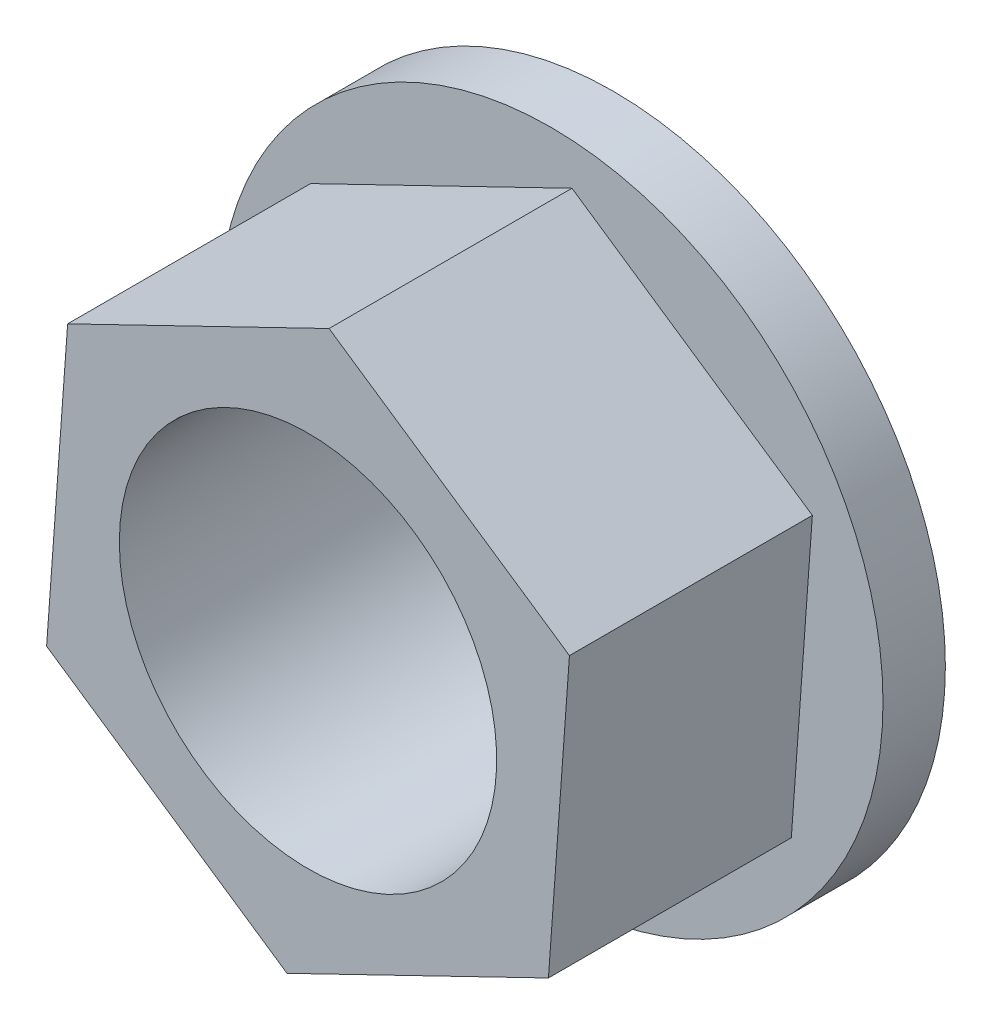
ISO-10303-21;
HEADER;
FILE_DESCRIPTION(('STEP AP214'),'2;1');
FILE_NAME('part.step','',(''),(''),'','','');
FILE_SCHEMA(('AUTOMOTIVE_DESIGN { 1 0 10303 214 1 1 1 1 }'));
ENDSEC;
DATA;
#1=APPLICATION_CONTEXT('core data for automotive mechanical design processes');
#2=APPLICATION_PROTOCOL_DEFINITION('international standard','automotive_design',2000,#1);
#3=PRODUCT_CONTEXT('',#1,'mechanical');
#4=PRODUCT('Part','Part','',(#3));
#5=PRODUCT_RELATED_PRODUCT_CATEGORY('part','',(#4));
#6=PRODUCT_DEFINITION_FORMATION('','',#4);
#7=PRODUCT_DEFINITION_CONTEXT('part definition',#1,'design');
#8=PRODUCT_DEFINITION('design','',#6,#7);
#9=PRODUCT_DEFINITION_SHAPE('','',#8);
#10=(LENGTH_UNIT() NAMED_UNIT(*) SI_UNIT(.MILLI.,.METRE.));
#11=(NAMED_UNIT(*) PLANE_ANGLE_UNIT() SI_UNIT($,.RADIAN.));
#12=(NAMED_UNIT(*) SI_UNIT($,.STERADIAN.) SOLID_ANGLE_UNIT());
#13=UNCERTAINTY_MEASURE_WITH_UNIT(LENGTH_MEASURE(1.E-05),#10,'distance_accuracy_value','');
#14=(GEOMETRIC_REPRESENTATION_CONTEXT(3) GLOBAL_UNCERTAINTY_ASSIGNED_CONTEXT((#13)) GLOBAL_UNIT_ASSIGNED_CONTEXT((#10,
#11,#12)) REPRESENTATION_CONTEXT('',''));
#15=CARTESIAN_POINT('',(0.,0.,0.));
#16=DIRECTION('',(0.,0.,1.));
#17=DIRECTION('',(1.,0.,0.));
#18=AXIS2_PLACEMENT_3D('',#15,#16,#17);
#19=CARTESIAN_POINT('',(0.,0.,0.7874));
#20=DIRECTION('',(0.,0.,1.));
#21=DIRECTION('',(1.,0.,0.));
#22=AXIS2_PLACEMENT_3D('',#19,#20,#21);
#23=PLANE('',#22);
#24=CARTESIAN_POINT('',(0.,0.,0.7874));
#25=DIRECTION('',(0.,0.,1.));
#26=DIRECTION('',(1.,0.,0.));
#27=AXIS2_PLACEMENT_3D('',#24,#25,#26);
#28=CIRCLE('',#27,4.191);
#29=CARTESIAN_POINT('',(4.191,0.,0.7874));
#30=VERTEX_POINT('',#29);
#31=EDGE_CURVE('E12',#30,#30,#28,.T.);
#32=ORIENTED_EDGE('',*,*,#31,.T.);
#33=EDGE_LOOP('',(#32));
#34=FACE_BOUND('',#33,.T.);
#35=DIRECTION('',(-0.899936060407233,-0.436021888416979,0.));
#36=VECTOR('',#35,1.);
#37=CARTESIAN_POINT('',(1.38436949572391,-2.85729699179297,0.7874));
#38=LINE('',#37,#36);
#39=CARTESIAN_POINT('',(3.03403068309029,-2.05803089077886,0.7874));
#40=VERTEX_POINT('',#39);
#41=CARTESIAN_POINT('',(-0.265291691642468,-3.65656309280707,0.7874));
#42=VERTEX_POINT('',#41);
#43=EDGE_CURVE('E132',#40,#42,#38,.T.);
#44=ORIENTED_EDGE('',*,*,#43,.T.);
#45=DIRECTION('',(-0.827574062178784,0.561356545885862,0.));
#46=VECTOR('',#45,1.);
#47=CARTESIAN_POINT('',(-1.78230703318761,-2.62754764741764,0.7874));
#48=LINE('',#47,#46);
#49=CARTESIAN_POINT('',(-3.29932237473275,-1.59853220202821,0.7874));
#50=VERTEX_POINT('',#49);
#51=EDGE_CURVE('E64',#42,#50,#48,.T.);
#52=ORIENTED_EDGE('',*,*,#51,.T.);
#53=DIRECTION('',(0.072361998228448,0.997378434302841,0.));
#54=VECTOR('',#53,1.);
#55=CARTESIAN_POINT('',(-3.16667652891152,0.229749344375323,0.7874));
#56=LINE('',#55,#54);
#57=CARTESIAN_POINT('',(-3.03403068309029,2.05803089077886,0.7874));
#58=VERTEX_POINT('',#57);
#59=EDGE_CURVE('E115',#50,#58,#56,.T.);
#60=ORIENTED_EDGE('',*,*,#59,.T.);
#61=DIRECTION('',(0.899936060407233,0.436021888416979,0.));
#62=VECTOR('',#61,1.);
#63=CARTESIAN_POINT('',(-1.38436949572391,2.85729699179297,0.7874));
#64=LINE('',#63,#62);
#65=CARTESIAN_POINT('',(0.265291691642464,3.65656309280707,0.7874));
#66=VERTEX_POINT('',#65);
#67=EDGE_CURVE('E118',#58,#66,#64,.T.);
#68=ORIENTED_EDGE('',*,*,#67,.T.);
#69=DIRECTION('',(0.827574062178785,-0.561356545885861,0.));
#70=VECTOR('',#69,1.);
#71=CARTESIAN_POINT('',(1.78230703318761,2.62754764741764,0.7874));
#72=LINE('',#71,#70);
#73=CARTESIAN_POINT('',(3.29932237473275,1.59853220202821,0.7874));
#74=VERTEX_POINT('',#73);
#75=EDGE_CURVE('E126',#66,#74,#72,.T.);
#76=ORIENTED_EDGE('',*,*,#75,.T.);
#77=DIRECTION('',(-0.0723619982284483,-0.997378434302841,0.));
#78=VECTOR('',#77,1.);
#79=CARTESIAN_POINT('',(3.16667652891152,-0.229749344375323,0.7874));
#80=LINE('',#79,#78);
#81=EDGE_CURVE('E129',#74,#40,#80,.T.);
#82=ORIENTED_EDGE('',*,*,#81,.T.);
#83=EDGE_LOOP('',(#44,#52,#60,#68,#76,#82));
#84=FACE_BOUND('',#83,.T.);
#85=ADVANCED_FACE('F41',(#34,#84),#23,.T.);
#86=CARTESIAN_POINT('',(0.,0.,0.7874));
#87=DIRECTION('',(0.,0.,-1.));
#88=DIRECTION('',(-1.,0.,0.));
#89=AXIS2_PLACEMENT_3D('',#86,#87,#88);
#90=CYLINDRICAL_SURFACE('',#89,4.191);
#91=ORIENTED_EDGE('',*,*,#31,.F.);
#92=EDGE_LOOP('',(#91));
#93=FACE_BOUND('',#92,.T.);
#94=CARTESIAN_POINT('',(0.,0.,0.));
#95=DIRECTION('',(0.,0.,1.));
#96=DIRECTION('',(1.,0.,0.));
#97=AXIS2_PLACEMENT_3D('',#94,#95,#96);
#98=CIRCLE('',#97,4.191);
#99=CARTESIAN_POINT('',(4.191,0.,0.));
#100=VERTEX_POINT('',#99);
#101=EDGE_CURVE('E45',#100,#100,#98,.T.);
#102=ORIENTED_EDGE('',*,*,#101,.T.);
#103=EDGE_LOOP('',(#102));
#104=FACE_BOUND('',#103,.T.);
#105=ADVANCED_FACE('F43',(#93,#104),#90,.T.);
#106=CARTESIAN_POINT('',(0.,0.,0.));
#107=DIRECTION('',(0.,0.,1.));
#108=DIRECTION('',(1.,0.,0.));
#109=AXIS2_PLACEMENT_3D('',#106,#107,#108);
#110=PLANE('',#109);
#111=CARTESIAN_POINT('',(0.,0.,0.));
#112=DIRECTION('',(0.,0.,-1.));
#113=DIRECTION('',(-1.,0.,0.));
#114=AXIS2_PLACEMENT_3D('',#111,#112,#113);
#115=CIRCLE('',#114,2.38125);
#116=CARTESIAN_POINT('',(-2.38125,0.,0.));
#117=VERTEX_POINT('',#116);
#118=EDGE_CURVE('E184',#117,#117,#115,.T.);
#119=ORIENTED_EDGE('',*,*,#118,.F.);
#120=EDGE_LOOP('',(#119));
#121=FACE_BOUND('',#120,.T.);
#122=ORIENTED_EDGE('',*,*,#101,.F.);
#123=EDGE_LOOP('',(#122));
#124=FACE_BOUND('',#123,.T.);
#125=ADVANCED_FACE('F139',(#121,#124),#110,.F.);
#126=CARTESIAN_POINT('',(-3.29932237473275,-1.59853220202821,3.85318));
#127=DIRECTION('',(0.561356545885862,0.827574062178784,0.));
#128=DIRECTION('',(-0.827574062178784,0.561356545885862,0.));
#129=AXIS2_PLACEMENT_3D('',#126,#127,#128);
#130=PLANE('',#129);
#131=ORIENTED_EDGE('',*,*,#51,.F.);
#132=DIRECTION('',(0.,0.,-1.));
#133=VECTOR('',#132,1.);
#134=CARTESIAN_POINT('',(-0.265291691642468,-3.65656309280707,3.85318));
#135=LINE('',#134,#133);
#136=CARTESIAN_POINT('',(-0.265291691642468,-3.65656309280707,3.85318));
#137=VERTEX_POINT('',#136);
#138=EDGE_CURVE('E99',#137,#42,#135,.T.);
#139=ORIENTED_EDGE('',*,*,#138,.F.);
#140=DIRECTION('',(0.827574062178784,-0.561356545885862,0.));
#141=VECTOR('',#140,1.);
#142=CARTESIAN_POINT('',(-3.29932237473275,-1.59853220202821,3.85318));
#143=LINE('',#142,#141);
#144=CARTESIAN_POINT('',(-3.29932237473275,-1.59853220202821,3.85318));
#145=VERTEX_POINT('',#144);
#146=EDGE_CURVE('E106',#145,#137,#143,.T.);
#147=ORIENTED_EDGE('',*,*,#146,.F.);
#148=DIRECTION('',(0.,0.,-1.));
#149=VECTOR('',#148,1.);
#150=CARTESIAN_POINT('',(-3.29932237473275,-1.59853220202821,3.85318));
#151=LINE('',#150,#149);
#152=EDGE_CURVE('E201',#145,#50,#151,.T.);
#153=ORIENTED_EDGE('',*,*,#152,.T.);
#154=EDGE_LOOP('',(#131,#139,#147,#153));
#155=FACE_BOUND('',#154,.T.);
#156=ADVANCED_FACE('F114',(#155),#130,.F.);
#157=CARTESIAN_POINT('',(-0.265291691642468,-3.65656309280707,3.85318));
#158=DIRECTION('',(-0.436021888416979,0.899936060407233,0.));
#159=DIRECTION('',(-0.899936060407233,-0.436021888416979,0.));
#160=AXIS2_PLACEMENT_3D('',#157,#158,#159);
#161=PLANE('',#160);
#162=ORIENTED_EDGE('',*,*,#43,.F.);
#163=DIRECTION('',(0.,0.,-1.));
#164=VECTOR('',#163,1.);
#165=CARTESIAN_POINT('',(3.03403068309029,-2.05803089077886,3.85318));
#166=LINE('',#165,#164);
#167=CARTESIAN_POINT('',(3.03403068309029,-2.05803089077886,3.85318));
#168=VERTEX_POINT('',#167);
#169=EDGE_CURVE('E102',#168,#40,#166,.T.);
#170=ORIENTED_EDGE('',*,*,#169,.F.);
#171=DIRECTION('',(0.899936060407233,0.436021888416979,0.));
#172=VECTOR('',#171,1.);
#173=CARTESIAN_POINT('',(-0.265291691642468,-3.65656309280707,3.85318));
#174=LINE('',#173,#172);
#175=EDGE_CURVE('E96',#137,#168,#174,.T.);
#176=ORIENTED_EDGE('',*,*,#175,.F.);
#177=ORIENTED_EDGE('',*,*,#138,.T.);
#178=EDGE_LOOP('',(#162,#170,#176,#177));
#179=FACE_BOUND('',#178,.T.);
#180=ADVANCED_FACE('F98',(#179),#161,.F.);
#181=CARTESIAN_POINT('',(3.03403068309029,-2.05803089077886,3.85318));
#182=DIRECTION('',(-0.997378434302841,0.0723619982284483,0.));
#183=DIRECTION('',(-0.0723619982284483,-0.997378434302841,0.));
#184=AXIS2_PLACEMENT_3D('',#181,#182,#183);
#185=PLANE('',#184);
#186=ORIENTED_EDGE('',*,*,#81,.F.);
#187=DIRECTION('',(0.,0.,-1.));
#188=VECTOR('',#187,1.);
#189=CARTESIAN_POINT('',(3.29932237473275,1.59853220202821,3.85318));
#190=LINE('',#189,#188);
#191=CARTESIAN_POINT('',(3.29932237473275,1.59853220202821,3.85318));
#192=VERTEX_POINT('',#191);
#193=EDGE_CURVE('E120',#192,#74,#190,.T.);
#194=ORIENTED_EDGE('',*,*,#193,.F.);
#195=DIRECTION('',(0.0723619982284483,0.997378434302841,0.));
#196=VECTOR('',#195,1.);
#197=CARTESIAN_POINT('',(3.03403068309029,-2.05803089077886,3.85318));
#198=LINE('',#197,#196);
#199=EDGE_CURVE('E105',#168,#192,#198,.T.);
#200=ORIENTED_EDGE('',*,*,#199,.F.);
#201=ORIENTED_EDGE('',*,*,#169,.T.);
#202=EDGE_LOOP('',(#186,#194,#200,#201));
#203=FACE_BOUND('',#202,.T.);
#204=ADVANCED_FACE('F157',(#203),#185,.F.);
#205=CARTESIAN_POINT('',(3.29932237473275,1.59853220202821,3.85318));
#206=DIRECTION('',(-0.561356545885861,-0.827574062178785,0.));
#207=DIRECTION('',(0.827574062178785,-0.561356545885861,0.));
#208=AXIS2_PLACEMENT_3D('',#205,#206,#207);
#209=PLANE('',#208);
#210=ORIENTED_EDGE('',*,*,#75,.F.);
#211=DIRECTION('',(0.,0.,-1.));
#212=VECTOR('',#211,1.);
#213=CARTESIAN_POINT('',(0.265291691642464,3.65656309280707,3.85318));
#214=LINE('',#213,#212);
#215=CARTESIAN_POINT('',(0.265291691642464,3.65656309280707,3.85318));
#216=VERTEX_POINT('',#215);
#217=EDGE_CURVE('E204',#216,#66,#214,.T.);
#218=ORIENTED_EDGE('',*,*,#217,.F.);
#219=DIRECTION('',(-0.827574062178785,0.561356545885861,0.));
#220=VECTOR('',#219,1.);
#221=CARTESIAN_POINT('',(3.29932237473275,1.59853220202821,3.85318));
#222=LINE('',#221,#220);
#223=EDGE_CURVE('E196',#192,#216,#222,.T.);
#224=ORIENTED_EDGE('',*,*,#223,.F.);
#225=ORIENTED_EDGE('',*,*,#193,.T.);
#226=EDGE_LOOP('',(#210,#218,#224,#225));
#227=FACE_BOUND('',#226,.T.);
#228=ADVANCED_FACE('F160',(#227),#209,.F.);
#229=CARTESIAN_POINT('',(0.265291691642464,3.65656309280707,3.85318));
#230=DIRECTION('',(0.436021888416979,-0.899936060407233,0.));
#231=DIRECTION('',(0.899936060407233,0.436021888416979,0.));
#232=AXIS2_PLACEMENT_3D('',#229,#230,#231);
#233=PLANE('',#232);
#234=ORIENTED_EDGE('',*,*,#67,.F.);
#235=DIRECTION('',(0.,0.,-1.));
#236=VECTOR('',#235,1.);
#237=CARTESIAN_POINT('',(-3.03403068309029,2.05803089077886,3.85318));
#238=LINE('',#237,#236);
#239=CARTESIAN_POINT('',(-3.03403068309029,2.05803089077886,3.85318));
#240=VERTEX_POINT('',#239);
#241=EDGE_CURVE('E56',#240,#58,#238,.T.);
#242=ORIENTED_EDGE('',*,*,#241,.F.);
#243=DIRECTION('',(-0.899936060407233,-0.436021888416979,0.));
#244=VECTOR('',#243,1.);
#245=CARTESIAN_POINT('',(0.265291691642464,3.65656309280707,3.85318));
#246=LINE('',#245,#244);
#247=EDGE_CURVE('E198',#216,#240,#246,.T.);
#248=ORIENTED_EDGE('',*,*,#247,.F.);
#249=ORIENTED_EDGE('',*,*,#217,.T.);
#250=EDGE_LOOP('',(#234,#242,#248,#249));
#251=FACE_BOUND('',#250,.T.);
#252=ADVANCED_FACE('F164',(#251),#233,.F.);
#253=CARTESIAN_POINT('',(-3.03403068309029,2.05803089077886,3.85318));
#254=DIRECTION('',(0.997378434302841,-0.072361998228448,0.));
#255=DIRECTION('',(0.072361998228448,0.997378434302841,0.));
#256=AXIS2_PLACEMENT_3D('',#253,#254,#255);
#257=PLANE('',#256);
#258=ORIENTED_EDGE('',*,*,#59,.F.);
#259=ORIENTED_EDGE('',*,*,#152,.F.);
#260=DIRECTION('',(-0.072361998228448,-0.997378434302841,0.));
#261=VECTOR('',#260,1.);
#262=CARTESIAN_POINT('',(-3.03403068309029,2.05803089077886,3.85318));
#263=LINE('',#262,#261);
#264=EDGE_CURVE('E110',#240,#145,#263,.T.);
#265=ORIENTED_EDGE('',*,*,#264,.F.);
#266=ORIENTED_EDGE('',*,*,#241,.T.);
#267=EDGE_LOOP('',(#258,#259,#265,#266));
#268=FACE_BOUND('',#267,.T.);
#269=ADVANCED_FACE('F168',(#268),#257,.F.);
#270=CARTESIAN_POINT('',(-0.265291691642469,-3.65656309280707,3.85318));
#271=DIRECTION('',(0.,0.,1.));
#272=DIRECTION('',(1.,0.,0.));
#273=AXIS2_PLACEMENT_3D('',#270,#271,#272);
#274=PLANE('',#273);
#275=CARTESIAN_POINT('',(0.,0.,3.85318));
#276=DIRECTION('',(0.,0.,-1.));
#277=DIRECTION('',(-1.,0.,0.));
#278=AXIS2_PLACEMENT_3D('',#275,#276,#277);
#279=CIRCLE('',#278,2.38125);
#280=CARTESIAN_POINT('',(-2.38125,0.,3.85318));
#281=VERTEX_POINT('',#280);
#282=EDGE_CURVE('E112',#281,#281,#279,.T.);
#283=ORIENTED_EDGE('',*,*,#282,.T.);
#284=EDGE_LOOP('',(#283));
#285=FACE_BOUND('',#284,.T.);
#286=ORIENTED_EDGE('',*,*,#146,.T.);
#287=ORIENTED_EDGE('',*,*,#175,.T.);
#288=ORIENTED_EDGE('',*,*,#199,.T.);
#289=ORIENTED_EDGE('',*,*,#223,.T.);
#290=ORIENTED_EDGE('',*,*,#247,.T.);
#291=ORIENTED_EDGE('',*,*,#264,.T.);
#292=EDGE_LOOP('',(#286,#287,#288,#289,#290,#291));
#293=FACE_BOUND('',#292,.T.);
#294=ADVANCED_FACE('F109',(#285,#293),#274,.T.);
#295=CARTESIAN_POINT('',(0.,0.,3.85318));
#296=DIRECTION('',(0.,0.,-1.));
#297=DIRECTION('',(-1.,0.,0.));
#298=AXIS2_PLACEMENT_3D('',#295,#296,#297);
#299=CYLINDRICAL_SURFACE('',#298,2.38125);
#300=ORIENTED_EDGE('',*,*,#282,.F.);
#301=EDGE_LOOP('',(#300));
#302=FACE_BOUND('',#301,.T.);
#303=ORIENTED_EDGE('',*,*,#118,.T.);
#304=EDGE_LOOP('',(#303));
#305=FACE_BOUND('',#304,.T.);
#306=ADVANCED_FACE('F174',(#302,#305),#299,.F.);
#307=CLOSED_SHELL('',(#85,#105,#125,#156,#180,#204,#228,#252,#269,#294,#306));
#308=MANIFOLD_SOLID_BREP('B2',#307);
#309=ADVANCED_BREP_SHAPE_REPRESENTATION('',(#18,#308),#14);
#310=SHAPE_DEFINITION_REPRESENTATION(#9,#309);
ENDSEC;
END-ISO-10303-21;
